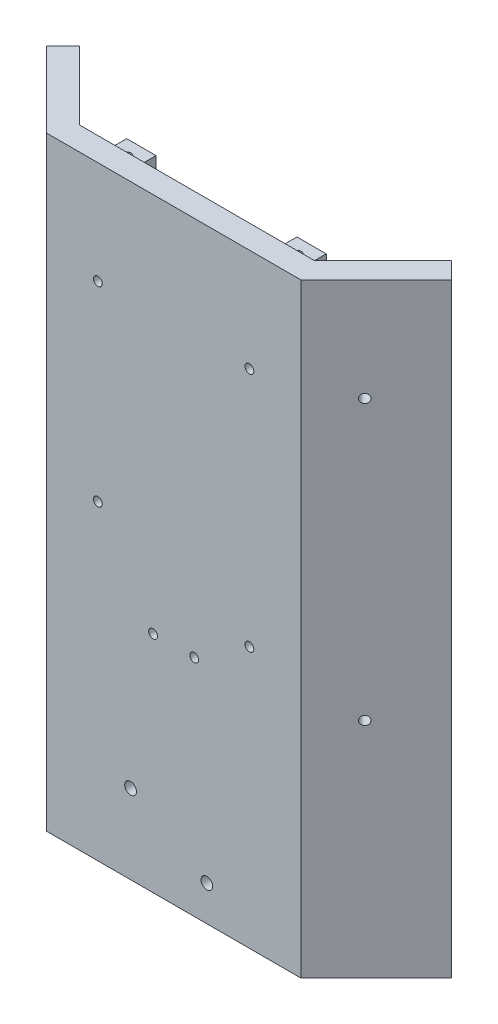
ISO-10303-21;
HEADER;
FILE_DESCRIPTION(('STEP AP214'),'2;1');
FILE_NAME('part.step','',(''),(''),'','','');
FILE_SCHEMA(('AUTOMOTIVE_DESIGN { 1 0 10303 214 1 1 1 1 }'));
ENDSEC;
DATA;
#1=APPLICATION_CONTEXT('core data for automotive mechanical design processes');
#2=APPLICATION_PROTOCOL_DEFINITION('international standard','automotive_design',2000,#1);
#3=PRODUCT_CONTEXT('',#1,'mechanical');
#4=PRODUCT('Part','Part','',(#3));
#5=PRODUCT_RELATED_PRODUCT_CATEGORY('part','',(#4));
#6=PRODUCT_DEFINITION_FORMATION('','',#4);
#7=PRODUCT_DEFINITION_CONTEXT('part definition',#1,'design');
#8=PRODUCT_DEFINITION('design','',#6,#7);
#9=PRODUCT_DEFINITION_SHAPE('','',#8);
#10=(LENGTH_UNIT() NAMED_UNIT(*) SI_UNIT(.MILLI.,.METRE.));
#11=(NAMED_UNIT(*) PLANE_ANGLE_UNIT() SI_UNIT($,.RADIAN.));
#12=(NAMED_UNIT(*) SI_UNIT($,.STERADIAN.) SOLID_ANGLE_UNIT());
#13=UNCERTAINTY_MEASURE_WITH_UNIT(LENGTH_MEASURE(1.E-05),#10,'distance_accuracy_value','');
#14=(GEOMETRIC_REPRESENTATION_CONTEXT(3) GLOBAL_UNCERTAINTY_ASSIGNED_CONTEXT((#13)) GLOBAL_UNIT_ASSIGNED_CONTEXT((#10,
#11,#12)) REPRESENTATION_CONTEXT('',''));
#15=CARTESIAN_POINT('',(0.,0.,0.));
#16=DIRECTION('',(0.,0.,1.));
#17=DIRECTION('',(1.,0.,0.));
#18=AXIS2_PLACEMENT_3D('',#15,#16,#17);
#19=CARTESIAN_POINT('',(-40.,206.,0.));
#20=DIRECTION('',(0.,0.,1.));
#21=DIRECTION('',(1.,0.,0.));
#22=AXIS2_PLACEMENT_3D('',#19,#20,#21);
#23=PLANE('',#22);
#24=CARTESIAN_POINT('',(25.8137084989848,89.,0.));
#25=DIRECTION('',(0.,0.,1.));
#26=DIRECTION('',(1.,0.,0.));
#27=AXIS2_PLACEMENT_3D('',#24,#25,#26);
#28=CIRCLE('',#27,1.5);
#29=CARTESIAN_POINT('',(27.3137084989848,89.,0.));
#30=VERTEX_POINT('',#29);
#31=EDGE_CURVE('E457',#30,#30,#28,.F.);
#32=ORIENTED_EDGE('',*,*,#31,.F.);
#33=EDGE_LOOP('',(#32));
#34=FACE_BOUND('',#33,.T.);
#35=CARTESIAN_POINT('',(-25.8137084989847,106.,0.));
#36=DIRECTION('',(0.,0.,1.));
#37=DIRECTION('',(1.,0.,0.));
#38=AXIS2_PLACEMENT_3D('',#35,#36,#37);
#39=CIRCLE('',#38,1.5);
#40=CARTESIAN_POINT('',(-24.3137084989847,106.,0.));
#41=VERTEX_POINT('',#40);
#42=EDGE_CURVE('E450',#41,#41,#39,.F.);
#43=ORIENTED_EDGE('',*,*,#42,.F.);
#44=EDGE_LOOP('',(#43));
#45=FACE_BOUND('',#44,.T.);
#46=CARTESIAN_POINT('',(25.8137084989848,171.,0.));
#47=DIRECTION('',(0.,0.,1.));
#48=DIRECTION('',(1.,0.,0.));
#49=AXIS2_PLACEMENT_3D('',#46,#47,#48);
#50=CIRCLE('',#49,1.49999999999999);
#51=CARTESIAN_POINT('',(27.3137084989848,171.,0.));
#52=VERTEX_POINT('',#51);
#53=EDGE_CURVE('E449',#52,#52,#50,.F.);
#54=ORIENTED_EDGE('',*,*,#53,.F.);
#55=EDGE_LOOP('',(#54));
#56=FACE_BOUND('',#55,.T.);
#57=CARTESIAN_POINT('',(-25.8137084989847,171.,0.));
#58=DIRECTION('',(0.,0.,1.));
#59=DIRECTION('',(1.,0.,0.));
#60=AXIS2_PLACEMENT_3D('',#57,#58,#59);
#61=CIRCLE('',#60,1.5);
#62=CARTESIAN_POINT('',(-24.3137084989847,171.,0.));
#63=VERTEX_POINT('',#62);
#64=EDGE_CURVE('E466',#63,#63,#61,.F.);
#65=ORIENTED_EDGE('',*,*,#64,.F.);
#66=EDGE_LOOP('',(#65));
#67=FACE_BOUND('',#66,.T.);
#68=CARTESIAN_POINT('',(7.,76.4040820577345,0.));
#69=DIRECTION('',(0.,0.,1.));
#70=DIRECTION('',(1.,0.,0.));
#71=AXIS2_PLACEMENT_3D('',#68,#69,#70);
#72=CIRCLE('',#71,1.5);
#73=CARTESIAN_POINT('',(8.5,76.4040820577345,0.));
#74=VERTEX_POINT('',#73);
#75=EDGE_CURVE('E473',#74,#74,#72,.F.);
#76=ORIENTED_EDGE('',*,*,#75,.F.);
#77=EDGE_LOOP('',(#76));
#78=FACE_BOUND('',#77,.T.);
#79=CARTESIAN_POINT('',(-7.,76.4040820577345,0.));
#80=DIRECTION('',(0.,0.,1.));
#81=DIRECTION('',(1.,0.,0.));
#82=AXIS2_PLACEMENT_3D('',#79,#80,#81);
#83=CIRCLE('',#82,1.5);
#84=CARTESIAN_POINT('',(-5.5,76.4040820577345,0.));
#85=VERTEX_POINT('',#84);
#86=EDGE_CURVE('E474',#85,#85,#83,.F.);
#87=ORIENTED_EDGE('',*,*,#86,.F.);
#88=EDGE_LOOP('',(#87));
#89=FACE_BOUND('',#88,.T.);
#90=CARTESIAN_POINT('',(-14.6670536145485,26.9999999999999,0.));
#91=DIRECTION('',(0.,0.,1.));
#92=DIRECTION('',(1.,0.,0.));
#93=AXIS2_PLACEMENT_3D('',#90,#91,#92);
#94=CIRCLE('',#93,2.);
#95=CARTESIAN_POINT('',(-12.6670536145485,26.9999999999999,0.));
#96=VERTEX_POINT('',#95);
#97=EDGE_CURVE('E485',#96,#96,#94,.F.);
#98=ORIENTED_EDGE('',*,*,#97,.F.);
#99=EDGE_LOOP('',(#98));
#100=FACE_BOUND('',#99,.T.);
#101=CARTESIAN_POINT('',(11.3137084989848,12.,0.));
#102=DIRECTION('',(0.,0.,1.));
#103=DIRECTION('',(1.,0.,0.));
#104=AXIS2_PLACEMENT_3D('',#101,#102,#103);
#105=CIRCLE('',#104,2.);
#106=CARTESIAN_POINT('',(13.3137084989848,12.,0.));
#107=VERTEX_POINT('',#106);
#108=EDGE_CURVE('E486',#107,#107,#105,.F.);
#109=ORIENTED_EDGE('',*,*,#108,.F.);
#110=EDGE_LOOP('',(#109));
#111=FACE_BOUND('',#110,.T.);
#112=DIRECTION('',(0.,1.,0.));
#113=VECTOR('',#112,1.);
#114=CARTESIAN_POINT('',(24.,200.,0.));
#115=LINE('',#114,#113);
#116=CARTESIAN_POINT('',(24.,194.,0.));
#117=VERTEX_POINT('',#116);
#118=CARTESIAN_POINT('',(24.,200.,0.));
#119=VERTEX_POINT('',#118);
#120=EDGE_CURVE('E167',#117,#119,#115,.T.);
#121=ORIENTED_EDGE('',*,*,#120,.F.);
#122=DIRECTION('',(-1.,0.,0.));
#123=VECTOR('',#122,1.);
#124=CARTESIAN_POINT('',(34.,194.,0.));
#125=LINE('',#124,#123);
#126=CARTESIAN_POINT('',(34.,194.,0.));
#127=VERTEX_POINT('',#126);
#128=EDGE_CURVE('E180',#127,#117,#125,.T.);
#129=ORIENTED_EDGE('',*,*,#128,.F.);
#130=DIRECTION('',(0.,-1.,0.));
#131=VECTOR('',#130,1.);
#132=CARTESIAN_POINT('',(34.,200.,0.));
#133=LINE('',#132,#131);
#134=CARTESIAN_POINT('',(34.,200.,0.));
#135=VERTEX_POINT('',#134);
#136=EDGE_CURVE('E189',#135,#127,#133,.T.);
#137=ORIENTED_EDGE('',*,*,#136,.F.);
#138=DIRECTION('',(1.,0.,0.));
#139=VECTOR('',#138,1.);
#140=CARTESIAN_POINT('',(34.,200.,0.));
#141=LINE('',#140,#139);
#142=EDGE_CURVE('E170',#119,#135,#141,.T.);
#143=ORIENTED_EDGE('',*,*,#142,.F.);
#144=EDGE_LOOP('',(#121,#129,#137,#143));
#145=FACE_BOUND('',#144,.T.);
#146=DIRECTION('',(-1.,0.,0.));
#147=VECTOR('',#146,1.);
#148=CARTESIAN_POINT('',(-40.,0.,0.));
#149=LINE('',#148,#147);
#150=CARTESIAN_POINT('',(40.,0.,0.));
#151=VERTEX_POINT('',#150);
#152=CARTESIAN_POINT('',(-40.,0.,0.));
#153=VERTEX_POINT('',#152);
#154=EDGE_CURVE('E210',#151,#153,#149,.T.);
#155=ORIENTED_EDGE('',*,*,#154,.T.);
#156=DIRECTION('',(0.,-1.,0.));
#157=VECTOR('',#156,1.);
#158=CARTESIAN_POINT('',(-40.,206.,0.));
#159=LINE('',#158,#157);
#160=CARTESIAN_POINT('',(-40.,206.,0.));
#161=VERTEX_POINT('',#160);
#162=EDGE_CURVE('E224',#161,#153,#159,.T.);
#163=ORIENTED_EDGE('',*,*,#162,.F.);
#164=DIRECTION('',(-1.,0.,0.));
#165=VECTOR('',#164,1.);
#166=CARTESIAN_POINT('',(-40.,206.,0.));
#167=LINE('',#166,#165);
#168=CARTESIAN_POINT('',(40.,206.,0.));
#169=VERTEX_POINT('',#168);
#170=EDGE_CURVE('E222',#169,#161,#167,.T.);
#171=ORIENTED_EDGE('',*,*,#170,.F.);
#172=DIRECTION('',(0.,-1.,0.));
#173=VECTOR('',#172,1.);
#174=CARTESIAN_POINT('',(40.,206.,0.));
#175=LINE('',#174,#173);
#176=EDGE_CURVE('E242',#169,#151,#175,.T.);
#177=ORIENTED_EDGE('',*,*,#176,.T.);
#178=EDGE_LOOP('',(#155,#163,#171,#177));
#179=FACE_BOUND('',#178,.T.);
#180=DIRECTION('',(0.,1.,0.));
#181=VECTOR('',#180,1.);
#182=CARTESIAN_POINT('',(-34.,200.,0.));
#183=LINE('',#182,#181);
#184=CARTESIAN_POINT('',(-34.,194.,0.));
#185=VERTEX_POINT('',#184);
#186=CARTESIAN_POINT('',(-34.,200.,0.));
#187=VERTEX_POINT('',#186);
#188=EDGE_CURVE('E166',#185,#187,#183,.T.);
#189=ORIENTED_EDGE('',*,*,#188,.F.);
#190=DIRECTION('',(-1.,0.,0.));
#191=VECTOR('',#190,1.);
#192=CARTESIAN_POINT('',(-24.,194.,0.));
#193=LINE('',#192,#191);
#194=CARTESIAN_POINT('',(-24.,194.,0.));
#195=VERTEX_POINT('',#194);
#196=EDGE_CURVE('E163',#195,#185,#193,.T.);
#197=ORIENTED_EDGE('',*,*,#196,.F.);
#198=DIRECTION('',(0.,-1.,0.));
#199=VECTOR('',#198,1.);
#200=CARTESIAN_POINT('',(-24.,200.,0.));
#201=LINE('',#200,#199);
#202=CARTESIAN_POINT('',(-24.,200.,0.));
#203=VERTEX_POINT('',#202);
#204=EDGE_CURVE('E53',#203,#195,#201,.T.);
#205=ORIENTED_EDGE('',*,*,#204,.F.);
#206=DIRECTION('',(1.,0.,0.));
#207=VECTOR('',#206,1.);
#208=CARTESIAN_POINT('',(-24.,200.,0.));
#209=LINE('',#208,#207);
#210=EDGE_CURVE('E48',#187,#203,#209,.T.);
#211=ORIENTED_EDGE('',*,*,#210,.F.);
#212=EDGE_LOOP('',(#189,#197,#205,#211));
#213=FACE_BOUND('',#212,.T.);
#214=ADVANCED_FACE('F33',(#34,#45,#56,#67,#78,#89,#100,#111,#145,#179,#213),#23,.F.);
#215=CARTESIAN_POINT('',(-40.,206.,0.));
#216=DIRECTION('',(-0.707106781186544,0.,0.707106781186551));
#217=DIRECTION('',(0.707106781186551,0.,0.707106781186544));
#218=AXIS2_PLACEMENT_3D('',#215,#216,#217);
#219=PLANE('',#218);
#220=CARTESIAN_POINT('',(-50.6985255993525,171.,-10.6985255993524));
#221=DIRECTION('',(-0.707106781186544,0.,0.707106781186551));
#222=DIRECTION('',(0.707106781186551,0.,0.707106781186544));
#223=AXIS2_PLACEMENT_3D('',#220,#221,#222);
#224=CIRCLE('',#223,1.50000000000001);
#225=CARTESIAN_POINT('',(-49.6378654275727,171.,-9.63786542757258));
#226=VERTEX_POINT('',#225);
#227=EDGE_CURVE('E440',#226,#226,#224,.F.);
#228=ORIENTED_EDGE('',*,*,#227,.F.);
#229=EDGE_LOOP('',(#228));
#230=FACE_BOUND('',#229,.T.);
#231=CARTESIAN_POINT('',(-50.6985255993525,81.,-10.6985255993524));
#232=DIRECTION('',(-0.707106781186544,0.,0.707106781186551));
#233=DIRECTION('',(0.707106781186551,0.,0.707106781186544));
#234=AXIS2_PLACEMENT_3D('',#231,#232,#233);
#235=CIRCLE('',#234,1.5);
#236=CARTESIAN_POINT('',(-49.6378654275727,81.,-9.63786542757259));
#237=VERTEX_POINT('',#236);
#238=EDGE_CURVE('E427',#237,#237,#235,.F.);
#239=ORIENTED_EDGE('',*,*,#238,.F.);
#240=EDGE_LOOP('',(#239));
#241=FACE_BOUND('',#240,.T.);
#242=DIRECTION('',(-0.707106781186551,0.,-0.707106781186544));
#243=VECTOR('',#242,1.);
#244=CARTESIAN_POINT('',(-40.,0.,0.));
#245=LINE('',#244,#243);
#246=CARTESIAN_POINT('',(-63.3345237791562,0.,-23.334523779156));
#247=VERTEX_POINT('',#246);
#248=EDGE_CURVE('E205',#153,#247,#245,.T.);
#249=ORIENTED_EDGE('',*,*,#248,.T.);
#250=DIRECTION('',(0.,-1.,0.));
#251=VECTOR('',#250,1.);
#252=CARTESIAN_POINT('',(-63.3345237791562,206.,-23.334523779156));
#253=LINE('',#252,#251);
#254=CARTESIAN_POINT('',(-63.3345237791562,206.,-23.334523779156));
#255=VERTEX_POINT('',#254);
#256=EDGE_CURVE('E11',#255,#247,#253,.T.);
#257=ORIENTED_EDGE('',*,*,#256,.F.);
#258=DIRECTION('',(-0.707106781186551,0.,-0.707106781186544));
#259=VECTOR('',#258,1.);
#260=CARTESIAN_POINT('',(-40.,206.,0.));
#261=LINE('',#260,#259);
#262=EDGE_CURVE('E206',#161,#255,#261,.T.);
#263=ORIENTED_EDGE('',*,*,#262,.F.);
#264=ORIENTED_EDGE('',*,*,#162,.T.);
#265=EDGE_LOOP('',(#249,#257,#263,#264));
#266=FACE_BOUND('',#265,.T.);
#267=ADVANCED_FACE('F35',(#230,#241,#266),#219,.F.);
#268=CARTESIAN_POINT('',(-68.9913780286485,206.,-17.6776695296635));
#269=DIRECTION('',(0.707106781186551,0.,0.707106781186544));
#270=DIRECTION('',(0.707106781186544,0.,-0.707106781186551));
#271=AXIS2_PLACEMENT_3D('',#268,#269,#270);
#272=PLANE('',#271);
#273=DIRECTION('',(-0.707106781186544,0.,0.707106781186551));
#274=VECTOR('',#273,1.);
#275=CARTESIAN_POINT('',(-68.9913780286485,0.,-17.6776695296635));
#276=LINE('',#275,#274);
#277=CARTESIAN_POINT('',(-68.9913780286485,0.,-17.6776695296635));
#278=VERTEX_POINT('',#277);
#279=EDGE_CURVE('E227',#247,#278,#276,.T.);
#280=ORIENTED_EDGE('',*,*,#279,.T.);
#281=DIRECTION('',(0.,-1.,0.));
#282=VECTOR('',#281,1.);
#283=CARTESIAN_POINT('',(-68.9913780286485,206.,-17.6776695296635));
#284=LINE('',#283,#282);
#285=CARTESIAN_POINT('',(-68.9913780286485,206.,-17.6776695296635));
#286=VERTEX_POINT('',#285);
#287=EDGE_CURVE('E41',#286,#278,#284,.T.);
#288=ORIENTED_EDGE('',*,*,#287,.F.);
#289=DIRECTION('',(-0.707106781186544,0.,0.707106781186551));
#290=VECTOR('',#289,1.);
#291=CARTESIAN_POINT('',(-68.9913780286485,206.,-17.6776695296635));
#292=LINE('',#291,#290);
#293=EDGE_CURVE('E209',#255,#286,#292,.T.);
#294=ORIENTED_EDGE('',*,*,#293,.F.);
#295=ORIENTED_EDGE('',*,*,#256,.T.);
#296=EDGE_LOOP('',(#280,#288,#294,#295));
#297=FACE_BOUND('',#296,.T.);
#298=ADVANCED_FACE('F284',(#297),#272,.F.);
#299=CARTESIAN_POINT('',(-43.3137084989847,206.,8.));
#300=DIRECTION('',(0.707106781186544,0.,-0.707106781186551));
#301=DIRECTION('',(-0.707106781186551,0.,-0.707106781186544));
#302=AXIS2_PLACEMENT_3D('',#299,#300,#301);
#303=PLANE('',#302);
#304=CARTESIAN_POINT('',(-56.3553798488449,171.,-5.04167134986));
#305=DIRECTION('',(-0.707106781186544,0.,0.707106781186551));
#306=DIRECTION('',(0.707106781186551,0.,0.707106781186544));
#307=AXIS2_PLACEMENT_3D('',#304,#305,#306);
#308=CIRCLE('',#307,1.50000000000001);
#309=CARTESIAN_POINT('',(-55.294719677065,171.,-3.98101117808018));
#310=VERTEX_POINT('',#309);
#311=EDGE_CURVE('E437',#310,#310,#308,.T.);
#312=ORIENTED_EDGE('',*,*,#311,.F.);
#313=EDGE_LOOP('',(#312));
#314=FACE_BOUND('',#313,.T.);
#315=CARTESIAN_POINT('',(-56.3553798488449,81.,-5.04167134986));
#316=DIRECTION('',(-0.707106781186544,0.,0.707106781186551));
#317=DIRECTION('',(0.707106781186551,0.,0.707106781186544));
#318=AXIS2_PLACEMENT_3D('',#315,#316,#317);
#319=CIRCLE('',#318,1.5);
#320=CARTESIAN_POINT('',(-55.294719677065,81.,-3.98101117808019));
#321=VERTEX_POINT('',#320);
#322=EDGE_CURVE('E424',#321,#321,#319,.T.);
#323=ORIENTED_EDGE('',*,*,#322,.F.);
#324=EDGE_LOOP('',(#323));
#325=FACE_BOUND('',#324,.T.);
#326=DIRECTION('',(0.707106781186551,0.,0.707106781186544));
#327=VECTOR('',#326,1.);
#328=CARTESIAN_POINT('',(-43.3137084989847,0.,8.));
#329=LINE('',#328,#327);
#330=CARTESIAN_POINT('',(-43.3137084989847,0.,8.));
#331=VERTEX_POINT('',#330);
#332=EDGE_CURVE('E229',#278,#331,#329,.T.);
#333=ORIENTED_EDGE('',*,*,#332,.T.);
#334=DIRECTION('',(0.,-1.,0.));
#335=VECTOR('',#334,1.);
#336=CARTESIAN_POINT('',(-43.3137084989847,206.,8.));
#337=LINE('',#336,#335);
#338=CARTESIAN_POINT('',(-43.3137084989847,206.,8.));
#339=VERTEX_POINT('',#338);
#340=EDGE_CURVE('E254',#339,#331,#337,.T.);
#341=ORIENTED_EDGE('',*,*,#340,.F.);
#342=DIRECTION('',(0.707106781186551,0.,0.707106781186544));
#343=VECTOR('',#342,1.);
#344=CARTESIAN_POINT('',(-43.3137084989847,206.,8.));
#345=LINE('',#344,#343);
#346=EDGE_CURVE('E212',#286,#339,#345,.T.);
#347=ORIENTED_EDGE('',*,*,#346,.F.);
#348=ORIENTED_EDGE('',*,*,#287,.T.);
#349=EDGE_LOOP('',(#333,#341,#347,#348));
#350=FACE_BOUND('',#349,.T.);
#351=ADVANCED_FACE('F261',(#314,#325,#350),#303,.F.);
#352=CARTESIAN_POINT('',(-43.3137084989847,206.,8.));
#353=DIRECTION('',(0.,0.,-1.));
#354=DIRECTION('',(-1.,0.,0.));
#355=AXIS2_PLACEMENT_3D('',#352,#353,#354);
#356=PLANE('',#355);
#357=CARTESIAN_POINT('',(25.8137084989848,89.,8.));
#358=DIRECTION('',(0.,0.,1.));
#359=DIRECTION('',(1.,0.,0.));
#360=AXIS2_PLACEMENT_3D('',#357,#358,#359);
#361=CIRCLE('',#360,1.5);
#362=CARTESIAN_POINT('',(27.3137084989848,89.,8.));
#363=VERTEX_POINT('',#362);
#364=EDGE_CURVE('E442',#363,#363,#361,.T.);
#365=ORIENTED_EDGE('',*,*,#364,.F.);
#366=EDGE_LOOP('',(#365));
#367=FACE_BOUND('',#366,.T.);
#368=CARTESIAN_POINT('',(-25.8137084989847,106.,8.));
#369=DIRECTION('',(0.,0.,1.));
#370=DIRECTION('',(1.,0.,0.));
#371=AXIS2_PLACEMENT_3D('',#368,#369,#370);
#372=CIRCLE('',#371,1.5);
#373=CARTESIAN_POINT('',(-24.3137084989847,106.,8.));
#374=VERTEX_POINT('',#373);
#375=EDGE_CURVE('E454',#374,#374,#372,.T.);
#376=ORIENTED_EDGE('',*,*,#375,.F.);
#377=EDGE_LOOP('',(#376));
#378=FACE_BOUND('',#377,.T.);
#379=CARTESIAN_POINT('',(25.8137084989848,171.,8.));
#380=DIRECTION('',(0.,0.,1.));
#381=DIRECTION('',(1.,0.,0.));
#382=AXIS2_PLACEMENT_3D('',#379,#380,#381);
#383=CIRCLE('',#382,1.49999999999999);
#384=CARTESIAN_POINT('',(27.3137084989848,171.,8.));
#385=VERTEX_POINT('',#384);
#386=EDGE_CURVE('E446',#385,#385,#383,.T.);
#387=ORIENTED_EDGE('',*,*,#386,.F.);
#388=EDGE_LOOP('',(#387));
#389=FACE_BOUND('',#388,.T.);
#390=CARTESIAN_POINT('',(-25.8137084989847,171.,8.));
#391=DIRECTION('',(0.,0.,1.));
#392=DIRECTION('',(1.,0.,0.));
#393=AXIS2_PLACEMENT_3D('',#390,#391,#392);
#394=CIRCLE('',#393,1.5);
#395=CARTESIAN_POINT('',(-24.3137084989847,171.,8.));
#396=VERTEX_POINT('',#395);
#397=EDGE_CURVE('E453',#396,#396,#394,.T.);
#398=ORIENTED_EDGE('',*,*,#397,.F.);
#399=EDGE_LOOP('',(#398));
#400=FACE_BOUND('',#399,.T.);
#401=CARTESIAN_POINT('',(7.,76.4040820577345,8.));
#402=DIRECTION('',(0.,0.,1.));
#403=DIRECTION('',(1.,0.,0.));
#404=AXIS2_PLACEMENT_3D('',#401,#402,#403);
#405=CIRCLE('',#404,1.5);
#406=CARTESIAN_POINT('',(8.5,76.4040820577345,8.));
#407=VERTEX_POINT('',#406);
#408=EDGE_CURVE('E470',#407,#407,#405,.T.);
#409=ORIENTED_EDGE('',*,*,#408,.F.);
#410=EDGE_LOOP('',(#409));
#411=FACE_BOUND('',#410,.T.);
#412=CARTESIAN_POINT('',(-7.,76.4040820577345,8.));
#413=DIRECTION('',(0.,0.,1.));
#414=DIRECTION('',(1.,0.,0.));
#415=AXIS2_PLACEMENT_3D('',#412,#413,#414);
#416=CIRCLE('',#415,1.5);
#417=CARTESIAN_POINT('',(-5.5,76.4040820577345,8.));
#418=VERTEX_POINT('',#417);
#419=EDGE_CURVE('E469',#418,#418,#416,.T.);
#420=ORIENTED_EDGE('',*,*,#419,.F.);
#421=EDGE_LOOP('',(#420));
#422=FACE_BOUND('',#421,.T.);
#423=CARTESIAN_POINT('',(-14.6670536145485,26.9999999999999,8.));
#424=DIRECTION('',(0.,0.,1.));
#425=DIRECTION('',(1.,0.,0.));
#426=AXIS2_PLACEMENT_3D('',#423,#424,#425);
#427=CIRCLE('',#426,2.);
#428=CARTESIAN_POINT('',(-12.6670536145485,26.9999999999999,8.));
#429=VERTEX_POINT('',#428);
#430=EDGE_CURVE('E482',#429,#429,#427,.T.);
#431=ORIENTED_EDGE('',*,*,#430,.F.);
#432=EDGE_LOOP('',(#431));
#433=FACE_BOUND('',#432,.T.);
#434=CARTESIAN_POINT('',(11.3137084989848,12.,8.));
#435=DIRECTION('',(0.,0.,1.));
#436=DIRECTION('',(1.,0.,0.));
#437=AXIS2_PLACEMENT_3D('',#434,#435,#436);
#438=CIRCLE('',#437,2.);
#439=CARTESIAN_POINT('',(13.3137084989848,12.,8.));
#440=VERTEX_POINT('',#439);
#441=EDGE_CURVE('E477',#440,#440,#438,.T.);
#442=ORIENTED_EDGE('',*,*,#441,.F.);
#443=EDGE_LOOP('',(#442));
#444=FACE_BOUND('',#443,.T.);
#445=DIRECTION('',(1.,0.,0.));
#446=VECTOR('',#445,1.);
#447=CARTESIAN_POINT('',(-43.3137084989847,0.,8.));
#448=LINE('',#447,#446);
#449=CARTESIAN_POINT('',(43.3137084989848,0.,8.));
#450=VERTEX_POINT('',#449);
#451=EDGE_CURVE('E231',#331,#450,#448,.T.);
#452=ORIENTED_EDGE('',*,*,#451,.T.);
#453=DIRECTION('',(0.,-1.,0.));
#454=VECTOR('',#453,1.);
#455=CARTESIAN_POINT('',(43.3137084989848,206.,8.));
#456=LINE('',#455,#454);
#457=CARTESIAN_POINT('',(43.3137084989848,206.,8.));
#458=VERTEX_POINT('',#457);
#459=EDGE_CURVE('E251',#458,#450,#456,.T.);
#460=ORIENTED_EDGE('',*,*,#459,.F.);
#461=DIRECTION('',(1.,0.,0.));
#462=VECTOR('',#461,1.);
#463=CARTESIAN_POINT('',(-43.3137084989847,206.,8.));
#464=LINE('',#463,#462);
#465=EDGE_CURVE('E214',#339,#458,#464,.T.);
#466=ORIENTED_EDGE('',*,*,#465,.F.);
#467=ORIENTED_EDGE('',*,*,#340,.T.);
#468=EDGE_LOOP('',(#452,#460,#466,#467));
#469=FACE_BOUND('',#468,.T.);
#470=ADVANCED_FACE('F272',(#367,#378,#389,#400,#411,#422,#433,#444,#469),#356,.F.);
#471=CARTESIAN_POINT('',(43.3137084989848,206.,8.));
#472=DIRECTION('',(-0.707106781186549,0.,-0.707106781186546));
#473=DIRECTION('',(-0.707106781186546,0.,0.707106781186549));
#474=AXIS2_PLACEMENT_3D('',#471,#472,#473);
#475=PLANE('',#474);
#476=CARTESIAN_POINT('',(54.2128463018496,171.,-2.89913780286484));
#477=DIRECTION('',(0.707106781186549,0.,0.707106781186546));
#478=DIRECTION('',(0.707106781186546,0.,-0.707106781186549));
#479=AXIS2_PLACEMENT_3D('',#476,#477,#478);
#480=CIRCLE('',#479,1.50000000000001);
#481=CARTESIAN_POINT('',(55.2735064736294,171.,-3.95979797464467));
#482=VERTEX_POINT('',#481);
#483=EDGE_CURVE('E420',#482,#482,#480,.T.);
#484=ORIENTED_EDGE('',*,*,#483,.F.);
#485=EDGE_LOOP('',(#484));
#486=FACE_BOUND('',#485,.T.);
#487=CARTESIAN_POINT('',(54.2128463018496,76.,-2.89913780286484));
#488=DIRECTION('',(0.707106781186549,0.,0.707106781186546));
#489=DIRECTION('',(0.707106781186546,0.,-0.707106781186549));
#490=AXIS2_PLACEMENT_3D('',#487,#488,#489);
#491=CIRCLE('',#490,1.5);
#492=CARTESIAN_POINT('',(55.2735064736294,76.,-3.95979797464467));
#493=VERTEX_POINT('',#492);
#494=EDGE_CURVE('E432',#493,#493,#491,.T.);
#495=ORIENTED_EDGE('',*,*,#494,.F.);
#496=EDGE_LOOP('',(#495));
#497=FACE_BOUND('',#496,.T.);
#498=DIRECTION('',(0.707106781186546,0.,-0.707106781186549));
#499=VECTOR('',#498,1.);
#500=CARTESIAN_POINT('',(43.3137084989848,0.,8.));
#501=LINE('',#500,#499);
#502=CARTESIAN_POINT('',(68.9913780286484,0.,-17.6776695296637));
#503=VERTEX_POINT('',#502);
#504=EDGE_CURVE('E233',#450,#503,#501,.T.);
#505=ORIENTED_EDGE('',*,*,#504,.T.);
#506=DIRECTION('',(0.,-1.,0.));
#507=VECTOR('',#506,1.);
#508=CARTESIAN_POINT('',(68.9913780286484,206.,-17.6776695296637));
#509=LINE('',#508,#507);
#510=CARTESIAN_POINT('',(68.9913780286484,206.,-17.6776695296637));
#511=VERTEX_POINT('',#510);
#512=EDGE_CURVE('E248',#511,#503,#509,.T.);
#513=ORIENTED_EDGE('',*,*,#512,.F.);
#514=DIRECTION('',(0.707106781186546,0.,-0.707106781186549));
#515=VECTOR('',#514,1.);
#516=CARTESIAN_POINT('',(43.3137084989848,206.,8.));
#517=LINE('',#516,#515);
#518=EDGE_CURVE('E216',#458,#511,#517,.T.);
#519=ORIENTED_EDGE('',*,*,#518,.F.);
#520=ORIENTED_EDGE('',*,*,#459,.T.);
#521=EDGE_LOOP('',(#505,#513,#519,#520));
#522=FACE_BOUND('',#521,.T.);
#523=ADVANCED_FACE('F276',(#486,#497,#522),#475,.F.);
#524=CARTESIAN_POINT('',(68.9913780286484,206.,-17.6776695296637));
#525=DIRECTION('',(-0.707106781186546,0.,0.707106781186549));
#526=DIRECTION('',(0.707106781186549,0.,0.707106781186546));
#527=AXIS2_PLACEMENT_3D('',#524,#525,#526);
#528=PLANE('',#527);
#529=DIRECTION('',(-0.707106781186549,0.,-0.707106781186546));
#530=VECTOR('',#529,1.);
#531=CARTESIAN_POINT('',(68.9913780286484,0.,-17.6776695296637));
#532=LINE('',#531,#530);
#533=CARTESIAN_POINT('',(63.334523779156,0.,-23.3345237791561));
#534=VERTEX_POINT('',#533);
#535=EDGE_CURVE('E235',#503,#534,#532,.T.);
#536=ORIENTED_EDGE('',*,*,#535,.T.);
#537=DIRECTION('',(0.,-1.,0.));
#538=VECTOR('',#537,1.);
#539=CARTESIAN_POINT('',(63.334523779156,206.,-23.3345237791561));
#540=LINE('',#539,#538);
#541=CARTESIAN_POINT('',(63.334523779156,206.,-23.3345237791561));
#542=VERTEX_POINT('',#541);
#543=EDGE_CURVE('E245',#542,#534,#540,.T.);
#544=ORIENTED_EDGE('',*,*,#543,.F.);
#545=DIRECTION('',(-0.707106781186549,0.,-0.707106781186546));
#546=VECTOR('',#545,1.);
#547=CARTESIAN_POINT('',(68.9913780286484,206.,-17.6776695296637));
#548=LINE('',#547,#546);
#549=EDGE_CURVE('E218',#511,#542,#548,.T.);
#550=ORIENTED_EDGE('',*,*,#549,.F.);
#551=ORIENTED_EDGE('',*,*,#512,.T.);
#552=EDGE_LOOP('',(#536,#544,#550,#551));
#553=FACE_BOUND('',#552,.T.);
#554=ADVANCED_FACE('F296',(#553),#528,.F.);
#555=CARTESIAN_POINT('',(40.,206.,0.));
#556=DIRECTION('',(0.707106781186549,0.,0.707106781186546));
#557=DIRECTION('',(0.707106781186546,0.,-0.707106781186549));
#558=AXIS2_PLACEMENT_3D('',#555,#556,#557);
#559=PLANE('',#558);
#560=CARTESIAN_POINT('',(48.5559920523572,171.,-8.55599205235721));
#561=DIRECTION('',(0.707106781186549,0.,0.707106781186546));
#562=DIRECTION('',(0.707106781186546,0.,-0.707106781186549));
#563=AXIS2_PLACEMENT_3D('',#560,#561,#562);
#564=CIRCLE('',#563,1.50000000000001);
#565=CARTESIAN_POINT('',(49.616652224137,171.,-9.61665222413704));
#566=VERTEX_POINT('',#565);
#567=EDGE_CURVE('E423',#566,#566,#564,.F.);
#568=ORIENTED_EDGE('',*,*,#567,.F.);
#569=EDGE_LOOP('',(#568));
#570=FACE_BOUND('',#569,.T.);
#571=CARTESIAN_POINT('',(48.5559920523572,76.,-8.55599205235721));
#572=DIRECTION('',(0.707106781186549,0.,0.707106781186546));
#573=DIRECTION('',(0.707106781186546,0.,-0.707106781186549));
#574=AXIS2_PLACEMENT_3D('',#571,#572,#573);
#575=CIRCLE('',#574,1.5);
#576=CARTESIAN_POINT('',(49.616652224137,76.,-9.61665222413704));
#577=VERTEX_POINT('',#576);
#578=EDGE_CURVE('E429',#577,#577,#575,.F.);
#579=ORIENTED_EDGE('',*,*,#578,.F.);
#580=EDGE_LOOP('',(#579));
#581=FACE_BOUND('',#580,.T.);
#582=DIRECTION('',(-0.707106781186546,0.,0.707106781186549));
#583=VECTOR('',#582,1.);
#584=CARTESIAN_POINT('',(40.,0.,0.));
#585=LINE('',#584,#583);
#586=EDGE_CURVE('E237',#534,#151,#585,.T.);
#587=ORIENTED_EDGE('',*,*,#586,.T.);
#588=ORIENTED_EDGE('',*,*,#176,.F.);
#589=DIRECTION('',(-0.707106781186546,0.,0.707106781186549));
#590=VECTOR('',#589,1.);
#591=CARTESIAN_POINT('',(40.,206.,0.));
#592=LINE('',#591,#590);
#593=EDGE_CURVE('E220',#542,#169,#592,.T.);
#594=ORIENTED_EDGE('',*,*,#593,.F.);
#595=ORIENTED_EDGE('',*,*,#543,.T.);
#596=EDGE_LOOP('',(#587,#588,#594,#595));
#597=FACE_BOUND('',#596,.T.);
#598=ADVANCED_FACE('F294',(#570,#581,#597),#559,.F.);
#599=CARTESIAN_POINT('',(0.,206.,0.));
#600=DIRECTION('',(0.,-1.,0.));
#601=DIRECTION('',(0.,0.,-1.));
#602=AXIS2_PLACEMENT_3D('',#599,#600,#601);
#603=PLANE('',#602);
#604=ORIENTED_EDGE('',*,*,#262,.T.);
#605=ORIENTED_EDGE('',*,*,#293,.T.);
#606=ORIENTED_EDGE('',*,*,#346,.T.);
#607=ORIENTED_EDGE('',*,*,#465,.T.);
#608=ORIENTED_EDGE('',*,*,#518,.T.);
#609=ORIENTED_EDGE('',*,*,#549,.T.);
#610=ORIENTED_EDGE('',*,*,#593,.T.);
#611=ORIENTED_EDGE('',*,*,#170,.T.);
#612=EDGE_LOOP('',(#604,#605,#606,#607,#608,#609,#610,#611));
#613=FACE_BOUND('',#612,.T.);
#614=ADVANCED_FACE('F280',(#613),#603,.F.);
#615=CARTESIAN_POINT('',(0.,0.,0.));
#616=DIRECTION('',(0.,-1.,0.));
#617=DIRECTION('',(0.,0.,-1.));
#618=AXIS2_PLACEMENT_3D('',#615,#616,#617);
#619=PLANE('',#618);
#620=ORIENTED_EDGE('',*,*,#248,.F.);
#621=ORIENTED_EDGE('',*,*,#154,.F.);
#622=ORIENTED_EDGE('',*,*,#586,.F.);
#623=ORIENTED_EDGE('',*,*,#535,.F.);
#624=ORIENTED_EDGE('',*,*,#504,.F.);
#625=ORIENTED_EDGE('',*,*,#451,.F.);
#626=ORIENTED_EDGE('',*,*,#332,.F.);
#627=ORIENTED_EDGE('',*,*,#279,.F.);
#628=EDGE_LOOP('',(#620,#621,#622,#623,#624,#625,#626,#627));
#629=FACE_BOUND('',#628,.T.);
#630=ADVANCED_FACE('F267',(#629),#619,.T.);
#631=CARTESIAN_POINT('',(24.,200.,-10.));
#632=DIRECTION('',(1.,0.,0.));
#633=DIRECTION('',(0.,0.,-1.));
#634=AXIS2_PLACEMENT_3D('',#631,#632,#633);
#635=PLANE('',#634);
#636=ORIENTED_EDGE('',*,*,#120,.T.);
#637=DIRECTION('',(0.,0.,1.));
#638=VECTOR('',#637,1.);
#639=CARTESIAN_POINT('',(24.,200.,-10.));
#640=LINE('',#639,#638);
#641=CARTESIAN_POINT('',(24.,200.,-10.));
#642=VERTEX_POINT('',#641);
#643=EDGE_CURVE('E202',#642,#119,#640,.T.);
#644=ORIENTED_EDGE('',*,*,#643,.F.);
#645=DIRECTION('',(0.,1.,0.));
#646=VECTOR('',#645,1.);
#647=CARTESIAN_POINT('',(24.,200.,-10.));
#648=LINE('',#647,#646);
#649=CARTESIAN_POINT('',(24.,194.,-10.));
#650=VERTEX_POINT('',#649);
#651=EDGE_CURVE('E176',#650,#642,#648,.T.);
#652=ORIENTED_EDGE('',*,*,#651,.F.);
#653=DIRECTION('',(0.,0.,1.));
#654=VECTOR('',#653,1.);
#655=CARTESIAN_POINT('',(24.,194.,-10.));
#656=LINE('',#655,#654);
#657=EDGE_CURVE('E185',#650,#117,#656,.T.);
#658=ORIENTED_EDGE('',*,*,#657,.T.);
#659=EDGE_LOOP('',(#636,#644,#652,#658));
#660=FACE_BOUND('',#659,.T.);
#661=ADVANCED_FACE('F323',(#660),#635,.F.);
#662=CARTESIAN_POINT('',(34.,200.,-10.));
#663=DIRECTION('',(0.,-1.,0.));
#664=DIRECTION('',(1.,0.,0.));
#665=AXIS2_PLACEMENT_3D('',#662,#663,#664);
#666=PLANE('',#665);
#667=CARTESIAN_POINT('',(29.,200.,-5.));
#668=DIRECTION('',(0.,1.,0.));
#669=DIRECTION('',(-1.,0.,0.));
#670=AXIS2_PLACEMENT_3D('',#667,#668,#669);
#671=CIRCLE('',#670,1.50000000000001);
#672=CARTESIAN_POINT('',(27.5,200.,-5.));
#673=VERTEX_POINT('',#672);
#674=EDGE_CURVE('E489',#673,#673,#671,.T.);
#675=ORIENTED_EDGE('',*,*,#674,.F.);
#676=EDGE_LOOP('',(#675));
#677=FACE_BOUND('',#676,.T.);
#678=ORIENTED_EDGE('',*,*,#142,.T.);
#679=DIRECTION('',(0.,0.,1.));
#680=VECTOR('',#679,1.);
#681=CARTESIAN_POINT('',(34.,200.,-10.));
#682=LINE('',#681,#680);
#683=CARTESIAN_POINT('',(34.,200.,-10.));
#684=VERTEX_POINT('',#683);
#685=EDGE_CURVE('E199',#684,#135,#682,.T.);
#686=ORIENTED_EDGE('',*,*,#685,.F.);
#687=DIRECTION('',(1.,0.,0.));
#688=VECTOR('',#687,1.);
#689=CARTESIAN_POINT('',(34.,200.,-10.));
#690=LINE('',#689,#688);
#691=EDGE_CURVE('E179',#642,#684,#690,.T.);
#692=ORIENTED_EDGE('',*,*,#691,.F.);
#693=ORIENTED_EDGE('',*,*,#643,.T.);
#694=EDGE_LOOP('',(#678,#686,#692,#693));
#695=FACE_BOUND('',#694,.T.);
#696=ADVANCED_FACE('F328',(#677,#695),#666,.F.);
#697=CARTESIAN_POINT('',(34.,200.,-10.));
#698=DIRECTION('',(-1.,0.,0.));
#699=DIRECTION('',(0.,0.,1.));
#700=AXIS2_PLACEMENT_3D('',#697,#698,#699);
#701=PLANE('',#700);
#702=ORIENTED_EDGE('',*,*,#136,.T.);
#703=DIRECTION('',(0.,0.,1.));
#704=VECTOR('',#703,1.);
#705=CARTESIAN_POINT('',(34.,194.,-10.));
#706=LINE('',#705,#704);
#707=CARTESIAN_POINT('',(34.,194.,-10.));
#708=VERTEX_POINT('',#707);
#709=EDGE_CURVE('E196',#708,#127,#706,.T.);
#710=ORIENTED_EDGE('',*,*,#709,.F.);
#711=DIRECTION('',(0.,-1.,0.));
#712=VECTOR('',#711,1.);
#713=CARTESIAN_POINT('',(34.,200.,-10.));
#714=LINE('',#713,#712);
#715=EDGE_CURVE('E182',#684,#708,#714,.T.);
#716=ORIENTED_EDGE('',*,*,#715,.F.);
#717=ORIENTED_EDGE('',*,*,#685,.T.);
#718=EDGE_LOOP('',(#702,#710,#716,#717));
#719=FACE_BOUND('',#718,.T.);
#720=ADVANCED_FACE('F332',(#719),#701,.F.);
#721=CARTESIAN_POINT('',(34.,194.,-10.));
#722=DIRECTION('',(0.,1.,0.));
#723=DIRECTION('',(0.,0.,1.));
#724=AXIS2_PLACEMENT_3D('',#721,#722,#723);
#725=PLANE('',#724);
#726=CARTESIAN_POINT('',(29.,194.,-5.));
#727=DIRECTION('',(0.,1.,0.));
#728=DIRECTION('',(0.,0.,1.));
#729=AXIS2_PLACEMENT_3D('',#726,#727,#728);
#730=CIRCLE('',#729,1.50000000000001);
#731=CARTESIAN_POINT('',(29.,194.,-3.49999999999999));
#732=VERTEX_POINT('',#731);
#733=EDGE_CURVE('E498',#732,#732,#730,.F.);
#734=ORIENTED_EDGE('',*,*,#733,.F.);
#735=EDGE_LOOP('',(#734));
#736=FACE_BOUND('',#735,.T.);
#737=ORIENTED_EDGE('',*,*,#128,.T.);
#738=ORIENTED_EDGE('',*,*,#657,.F.);
#739=DIRECTION('',(-1.,0.,0.));
#740=VECTOR('',#739,1.);
#741=CARTESIAN_POINT('',(34.,194.,-10.));
#742=LINE('',#741,#740);
#743=EDGE_CURVE('E184',#708,#650,#742,.T.);
#744=ORIENTED_EDGE('',*,*,#743,.F.);
#745=ORIENTED_EDGE('',*,*,#709,.T.);
#746=EDGE_LOOP('',(#737,#738,#744,#745));
#747=FACE_BOUND('',#746,.T.);
#748=ADVANCED_FACE('F336',(#736,#747),#725,.F.);
#749=CARTESIAN_POINT('',(0.,0.,-10.));
#750=DIRECTION('',(0.,0.,-1.));
#751=DIRECTION('',(-1.,0.,0.));
#752=AXIS2_PLACEMENT_3D('',#749,#750,#751);
#753=PLANE('',#752);
#754=ORIENTED_EDGE('',*,*,#651,.T.);
#755=ORIENTED_EDGE('',*,*,#691,.T.);
#756=ORIENTED_EDGE('',*,*,#715,.T.);
#757=ORIENTED_EDGE('',*,*,#743,.T.);
#758=EDGE_LOOP('',(#754,#755,#756,#757));
#759=FACE_BOUND('',#758,.T.);
#760=ADVANCED_FACE('F340',(#759),#753,.T.);
#761=CARTESIAN_POINT('',(-34.,200.,-9.99999999999999));
#762=DIRECTION('',(1.,0.,0.));
#763=DIRECTION('',(0.,0.,-1.));
#764=AXIS2_PLACEMENT_3D('',#761,#762,#763);
#765=PLANE('',#764);
#766=ORIENTED_EDGE('',*,*,#188,.T.);
#767=DIRECTION('',(0.,0.,1.));
#768=VECTOR('',#767,1.);
#769=CARTESIAN_POINT('',(-34.,200.,-9.99999999999999));
#770=LINE('',#769,#768);
#771=CARTESIAN_POINT('',(-34.,200.,-9.99999999999999));
#772=VERTEX_POINT('',#771);
#773=EDGE_CURVE('E147',#772,#187,#770,.T.);
#774=ORIENTED_EDGE('',*,*,#773,.F.);
#775=DIRECTION('',(0.,1.,0.));
#776=VECTOR('',#775,1.);
#777=CARTESIAN_POINT('',(-34.,200.,-9.99999999999999));
#778=LINE('',#777,#776);
#779=CARTESIAN_POINT('',(-34.,194.,-9.99999999999999));
#780=VERTEX_POINT('',#779);
#781=EDGE_CURVE('E154',#780,#772,#778,.T.);
#782=ORIENTED_EDGE('',*,*,#781,.F.);
#783=DIRECTION('',(0.,0.,1.));
#784=VECTOR('',#783,1.);
#785=CARTESIAN_POINT('',(-34.,194.,-9.99999999999999));
#786=LINE('',#785,#784);
#787=EDGE_CURVE('E507',#780,#185,#786,.T.);
#788=ORIENTED_EDGE('',*,*,#787,.T.);
#789=EDGE_LOOP('',(#766,#774,#782,#788));
#790=FACE_BOUND('',#789,.T.);
#791=ADVANCED_FACE('F165',(#790),#765,.F.);
#792=CARTESIAN_POINT('',(-24.,200.,-9.99999999999999));
#793=DIRECTION('',(0.,-1.,0.));
#794=DIRECTION('',(0.,0.,-1.));
#795=AXIS2_PLACEMENT_3D('',#792,#793,#794);
#796=PLANE('',#795);
#797=CARTESIAN_POINT('',(-29.,200.,-5.));
#798=DIRECTION('',(0.,1.,0.));
#799=DIRECTION('',(-1.,0.,0.));
#800=AXIS2_PLACEMENT_3D('',#797,#798,#799);
#801=CIRCLE('',#800,1.5);
#802=CARTESIAN_POINT('',(-30.5,200.,-5.));
#803=VERTEX_POINT('',#802);
#804=EDGE_CURVE('E494',#803,#803,#801,.T.);
#805=ORIENTED_EDGE('',*,*,#804,.F.);
#806=EDGE_LOOP('',(#805));
#807=FACE_BOUND('',#806,.T.);
#808=ORIENTED_EDGE('',*,*,#210,.T.);
#809=DIRECTION('',(0.,0.,1.));
#810=VECTOR('',#809,1.);
#811=CARTESIAN_POINT('',(-24.,200.,-9.99999999999999));
#812=LINE('',#811,#810);
#813=CARTESIAN_POINT('',(-24.,200.,-9.99999999999999));
#814=VERTEX_POINT('',#813);
#815=EDGE_CURVE('E150',#814,#203,#812,.T.);
#816=ORIENTED_EDGE('',*,*,#815,.F.);
#817=DIRECTION('',(1.,0.,0.));
#818=VECTOR('',#817,1.);
#819=CARTESIAN_POINT('',(-24.,200.,-9.99999999999999));
#820=LINE('',#819,#818);
#821=EDGE_CURVE('E143',#772,#814,#820,.T.);
#822=ORIENTED_EDGE('',*,*,#821,.F.);
#823=ORIENTED_EDGE('',*,*,#773,.T.);
#824=EDGE_LOOP('',(#808,#816,#822,#823));
#825=FACE_BOUND('',#824,.T.);
#826=ADVANCED_FACE('F145',(#807,#825),#796,.F.);
#827=CARTESIAN_POINT('',(-24.,200.,-9.99999999999999));
#828=DIRECTION('',(-1.,0.,0.));
#829=DIRECTION('',(0.,0.,1.));
#830=AXIS2_PLACEMENT_3D('',#827,#828,#829);
#831=PLANE('',#830);
#832=ORIENTED_EDGE('',*,*,#204,.T.);
#833=DIRECTION('',(0.,0.,1.));
#834=VECTOR('',#833,1.);
#835=CARTESIAN_POINT('',(-24.,194.,-9.99999999999999));
#836=LINE('',#835,#834);
#837=CARTESIAN_POINT('',(-24.,194.,-9.99999999999999));
#838=VERTEX_POINT('',#837);
#839=EDGE_CURVE('E172',#838,#195,#836,.T.);
#840=ORIENTED_EDGE('',*,*,#839,.F.);
#841=DIRECTION('',(0.,-1.,0.));
#842=VECTOR('',#841,1.);
#843=CARTESIAN_POINT('',(-24.,200.,-9.99999999999999));
#844=LINE('',#843,#842);
#845=EDGE_CURVE('E153',#814,#838,#844,.T.);
#846=ORIENTED_EDGE('',*,*,#845,.F.);
#847=ORIENTED_EDGE('',*,*,#815,.T.);
#848=EDGE_LOOP('',(#832,#840,#846,#847));
#849=FACE_BOUND('',#848,.T.);
#850=ADVANCED_FACE('F349',(#849),#831,.F.);
#851=CARTESIAN_POINT('',(-24.,194.,-9.99999999999999));
#852=DIRECTION('',(0.,1.,0.));
#853=DIRECTION('',(0.,0.,1.));
#854=AXIS2_PLACEMENT_3D('',#851,#852,#853);
#855=PLANE('',#854);
#856=CARTESIAN_POINT('',(-29.,194.,-5.));
#857=DIRECTION('',(0.,1.,0.));
#858=DIRECTION('',(0.,0.,1.));
#859=AXIS2_PLACEMENT_3D('',#856,#857,#858);
#860=CIRCLE('',#859,1.5);
#861=CARTESIAN_POINT('',(-29.,194.,-3.5));
#862=VERTEX_POINT('',#861);
#863=EDGE_CURVE('E497',#862,#862,#860,.F.);
#864=ORIENTED_EDGE('',*,*,#863,.F.);
#865=EDGE_LOOP('',(#864));
#866=FACE_BOUND('',#865,.T.);
#867=ORIENTED_EDGE('',*,*,#196,.T.);
#868=ORIENTED_EDGE('',*,*,#787,.F.);
#869=DIRECTION('',(-1.,0.,0.));
#870=VECTOR('',#869,1.);
#871=CARTESIAN_POINT('',(-24.,194.,-9.99999999999999));
#872=LINE('',#871,#870);
#873=EDGE_CURVE('E159',#838,#780,#872,.T.);
#874=ORIENTED_EDGE('',*,*,#873,.F.);
#875=ORIENTED_EDGE('',*,*,#839,.T.);
#876=EDGE_LOOP('',(#867,#868,#874,#875));
#877=FACE_BOUND('',#876,.T.);
#878=ADVANCED_FACE('F353',(#866,#877),#855,.F.);
#879=CARTESIAN_POINT('',(0.,0.,-10.));
#880=DIRECTION('',(0.,0.,-1.));
#881=DIRECTION('',(-1.,0.,0.));
#882=AXIS2_PLACEMENT_3D('',#879,#880,#881);
#883=PLANE('',#882);
#884=ORIENTED_EDGE('',*,*,#781,.T.);
#885=ORIENTED_EDGE('',*,*,#821,.T.);
#886=ORIENTED_EDGE('',*,*,#845,.T.);
#887=ORIENTED_EDGE('',*,*,#873,.T.);
#888=EDGE_LOOP('',(#884,#885,#886,#887));
#889=FACE_BOUND('',#888,.T.);
#890=ADVANCED_FACE('F157',(#889),#883,.T.);
#891=CARTESIAN_POINT('',(-29.0000000000006,-0.00100000000011202,-5.));
#892=DIRECTION('',(0.,1.,0.));
#893=DIRECTION('',(-1.,0.,0.));
#894=AXIS2_PLACEMENT_3D('',#891,#892,#893);
#895=CYLINDRICAL_SURFACE('',#894,1.5);
#896=ORIENTED_EDGE('',*,*,#804,.T.);
#897=EDGE_LOOP('',(#896));
#898=FACE_BOUND('',#897,.T.);
#899=ORIENTED_EDGE('',*,*,#863,.T.);
#900=EDGE_LOOP('',(#899));
#901=FACE_BOUND('',#900,.T.);
#902=ADVANCED_FACE('F360',(#898,#901),#895,.F.);
#903=CARTESIAN_POINT('',(28.9999999999994,-0.00100000000027856,-5.));
#904=DIRECTION('',(0.,1.,0.));
#905=DIRECTION('',(-1.,0.,0.));
#906=AXIS2_PLACEMENT_3D('',#903,#904,#905);
#907=CYLINDRICAL_SURFACE('',#906,1.50000000000001);
#908=ORIENTED_EDGE('',*,*,#674,.T.);
#909=EDGE_LOOP('',(#908));
#910=FACE_BOUND('',#909,.T.);
#911=ORIENTED_EDGE('',*,*,#733,.T.);
#912=EDGE_LOOP('',(#911));
#913=FACE_BOUND('',#912,.T.);
#914=ADVANCED_FACE('F361',(#910,#913),#907,.F.);
#915=CARTESIAN_POINT('',(11.3137084989848,12.,-23.3355237791561));
#916=DIRECTION('',(0.,0.,1.));
#917=DIRECTION('',(1.,0.,0.));
#918=AXIS2_PLACEMENT_3D('',#915,#916,#917);
#919=CYLINDRICAL_SURFACE('',#918,2.);
#920=ORIENTED_EDGE('',*,*,#441,.T.);
#921=EDGE_LOOP('',(#920));
#922=FACE_BOUND('',#921,.T.);
#923=ORIENTED_EDGE('',*,*,#108,.T.);
#924=EDGE_LOOP('',(#923));
#925=FACE_BOUND('',#924,.T.);
#926=ADVANCED_FACE('F364',(#922,#925),#919,.F.);
#927=CARTESIAN_POINT('',(-14.6670536145485,26.9999999999999,-23.3355237791561));
#928=DIRECTION('',(0.,0.,1.));
#929=DIRECTION('',(1.,0.,0.));
#930=AXIS2_PLACEMENT_3D('',#927,#928,#929);
#931=CYLINDRICAL_SURFACE('',#930,2.);
#932=ORIENTED_EDGE('',*,*,#430,.T.);
#933=EDGE_LOOP('',(#932));
#934=FACE_BOUND('',#933,.T.);
#935=ORIENTED_EDGE('',*,*,#97,.T.);
#936=EDGE_LOOP('',(#935));
#937=FACE_BOUND('',#936,.T.);
#938=ADVANCED_FACE('F371',(#934,#937),#931,.F.);
#939=CARTESIAN_POINT('',(-7.,76.4040820577345,-23.3355237791561));
#940=DIRECTION('',(0.,0.,1.));
#941=DIRECTION('',(1.,0.,0.));
#942=AXIS2_PLACEMENT_3D('',#939,#940,#941);
#943=CYLINDRICAL_SURFACE('',#942,1.5);
#944=ORIENTED_EDGE('',*,*,#419,.T.);
#945=EDGE_LOOP('',(#944));
#946=FACE_BOUND('',#945,.T.);
#947=ORIENTED_EDGE('',*,*,#86,.T.);
#948=EDGE_LOOP('',(#947));
#949=FACE_BOUND('',#948,.T.);
#950=ADVANCED_FACE('F375',(#946,#949),#943,.F.);
#951=CARTESIAN_POINT('',(7.,76.4040820577345,-23.3355237791561));
#952=DIRECTION('',(0.,0.,1.));
#953=DIRECTION('',(1.,0.,0.));
#954=AXIS2_PLACEMENT_3D('',#951,#952,#953);
#955=CYLINDRICAL_SURFACE('',#954,1.5);
#956=ORIENTED_EDGE('',*,*,#408,.T.);
#957=EDGE_LOOP('',(#956));
#958=FACE_BOUND('',#957,.T.);
#959=ORIENTED_EDGE('',*,*,#75,.T.);
#960=EDGE_LOOP('',(#959));
#961=FACE_BOUND('',#960,.T.);
#962=ADVANCED_FACE('F379',(#958,#961),#955,.F.);
#963=CARTESIAN_POINT('',(-25.8137084989847,171.,-23.3355237791561));
#964=DIRECTION('',(0.,0.,1.));
#965=DIRECTION('',(1.,0.,0.));
#966=AXIS2_PLACEMENT_3D('',#963,#964,#965);
#967=CYLINDRICAL_SURFACE('',#966,1.5);
#968=ORIENTED_EDGE('',*,*,#397,.T.);
#969=EDGE_LOOP('',(#968));
#970=FACE_BOUND('',#969,.T.);
#971=ORIENTED_EDGE('',*,*,#64,.T.);
#972=EDGE_LOOP('',(#971));
#973=FACE_BOUND('',#972,.T.);
#974=ADVANCED_FACE('F383',(#970,#973),#967,.F.);
#975=CARTESIAN_POINT('',(25.8137084989848,171.,-23.3355237791561));
#976=DIRECTION('',(0.,0.,1.));
#977=DIRECTION('',(1.,0.,0.));
#978=AXIS2_PLACEMENT_3D('',#975,#976,#977);
#979=CYLINDRICAL_SURFACE('',#978,1.49999999999999);
#980=ORIENTED_EDGE('',*,*,#386,.T.);
#981=EDGE_LOOP('',(#980));
#982=FACE_BOUND('',#981,.T.);
#983=ORIENTED_EDGE('',*,*,#53,.T.);
#984=EDGE_LOOP('',(#983));
#985=FACE_BOUND('',#984,.T.);
#986=ADVANCED_FACE('F387',(#982,#985),#979,.F.);
#987=CARTESIAN_POINT('',(-25.8137084989847,106.,-23.3355237791561));
#988=DIRECTION('',(0.,0.,1.));
#989=DIRECTION('',(1.,0.,0.));
#990=AXIS2_PLACEMENT_3D('',#987,#988,#989);
#991=CYLINDRICAL_SURFACE('',#990,1.5);
#992=ORIENTED_EDGE('',*,*,#375,.T.);
#993=EDGE_LOOP('',(#992));
#994=FACE_BOUND('',#993,.T.);
#995=ORIENTED_EDGE('',*,*,#42,.T.);
#996=EDGE_LOOP('',(#995));
#997=FACE_BOUND('',#996,.T.);
#998=ADVANCED_FACE('F393',(#994,#997),#991,.F.);
#999=CARTESIAN_POINT('',(25.8137084989848,89.,-23.3355237791561));
#1000=DIRECTION('',(0.,0.,1.));
#1001=DIRECTION('',(1.,0.,0.));
#1002=AXIS2_PLACEMENT_3D('',#999,#1000,#1001);
#1003=CYLINDRICAL_SURFACE('',#1002,1.5);
#1004=ORIENTED_EDGE('',*,*,#364,.T.);
#1005=EDGE_LOOP('',(#1004));
#1006=FACE_BOUND('',#1005,.T.);
#1007=ORIENTED_EDGE('',*,*,#31,.T.);
#1008=EDGE_LOOP('',(#1007));
#1009=FACE_BOUND('',#1008,.T.);
#1010=ADVANCED_FACE('F389',(#1006,#1009),#1003,.F.);
#1011=CARTESIAN_POINT('',(15.4654253045492,81.,-76.8624765032548));
#1012=DIRECTION('',(-0.707106781186544,0.,0.707106781186551));
#1013=DIRECTION('',(0.707106781186551,0.,0.707106781186544));
#1014=AXIS2_PLACEMENT_3D('',#1011,#1012,#1013);
#1015=CYLINDRICAL_SURFACE('',#1014,1.5);
#1016=ORIENTED_EDGE('',*,*,#322,.T.);
#1017=EDGE_LOOP('',(#1016));
#1018=FACE_BOUND('',#1017,.T.);
#1019=ORIENTED_EDGE('',*,*,#238,.T.);
#1020=EDGE_LOOP('',(#1019));
#1021=FACE_BOUND('',#1020,.T.);
#1022=ADVANCED_FACE('F392',(#1018,#1021),#1015,.F.);
#1023=CARTESIAN_POINT('',(15.4654253045492,171.,-76.8624765032548));
#1024=DIRECTION('',(-0.707106781186544,0.,0.707106781186551));
#1025=DIRECTION('',(0.707106781186551,0.,0.707106781186544));
#1026=AXIS2_PLACEMENT_3D('',#1023,#1024,#1025);
#1027=CYLINDRICAL_SURFACE('',#1026,1.50000000000001);
#1028=ORIENTED_EDGE('',*,*,#311,.T.);
#1029=EDGE_LOOP('',(#1028));
#1030=FACE_BOUND('',#1029,.T.);
#1031=ORIENTED_EDGE('',*,*,#227,.T.);
#1032=EDGE_LOOP('',(#1031));
#1033=FACE_BOUND('',#1032,.T.);
#1034=ADVANCED_FACE('F403',(#1030,#1033),#1027,.F.);
#1035=CARTESIAN_POINT('',(-17.6079588515453,76.,-74.7199429562595));
#1036=DIRECTION('',(0.707106781186549,0.,0.707106781186546));
#1037=DIRECTION('',(0.707106781186546,0.,-0.707106781186549));
#1038=AXIS2_PLACEMENT_3D('',#1035,#1036,#1037);
#1039=CYLINDRICAL_SURFACE('',#1038,1.5);
#1040=ORIENTED_EDGE('',*,*,#494,.T.);
#1041=EDGE_LOOP('',(#1040));
#1042=FACE_BOUND('',#1041,.T.);
#1043=ORIENTED_EDGE('',*,*,#578,.T.);
#1044=EDGE_LOOP('',(#1043));
#1045=FACE_BOUND('',#1044,.T.);
#1046=ADVANCED_FACE('F407',(#1042,#1045),#1039,.F.);
#1047=CARTESIAN_POINT('',(-17.6079588515453,171.,-74.7199429562595));
#1048=DIRECTION('',(0.707106781186549,0.,0.707106781186546));
#1049=DIRECTION('',(0.707106781186546,0.,-0.707106781186549));
#1050=AXIS2_PLACEMENT_3D('',#1047,#1048,#1049);
#1051=CYLINDRICAL_SURFACE('',#1050,1.50000000000001);
#1052=ORIENTED_EDGE('',*,*,#483,.T.);
#1053=EDGE_LOOP('',(#1052));
#1054=FACE_BOUND('',#1053,.T.);
#1055=ORIENTED_EDGE('',*,*,#567,.T.);
#1056=EDGE_LOOP('',(#1055));
#1057=FACE_BOUND('',#1056,.T.);
#1058=ADVANCED_FACE('F411',(#1054,#1057),#1051,.F.);
#1059=CLOSED_SHELL('',(#214,#267,#298,#351,#470,#523,#554,#598,#614,#630,#661,#696,#720,#748,
#760,#791,#826,#850,#878,#890,#902,#914,#926,#938,#950,#962,#974,#986,#998,#1010,#1022,#1034,
#1046,#1058));
#1060=MANIFOLD_SOLID_BREP('B2',#1059);
#1061=ADVANCED_BREP_SHAPE_REPRESENTATION('',(#18,#1060),#14);
#1062=SHAPE_DEFINITION_REPRESENTATION(#9,#1061);
ENDSEC;
END-ISO-10303-21;
